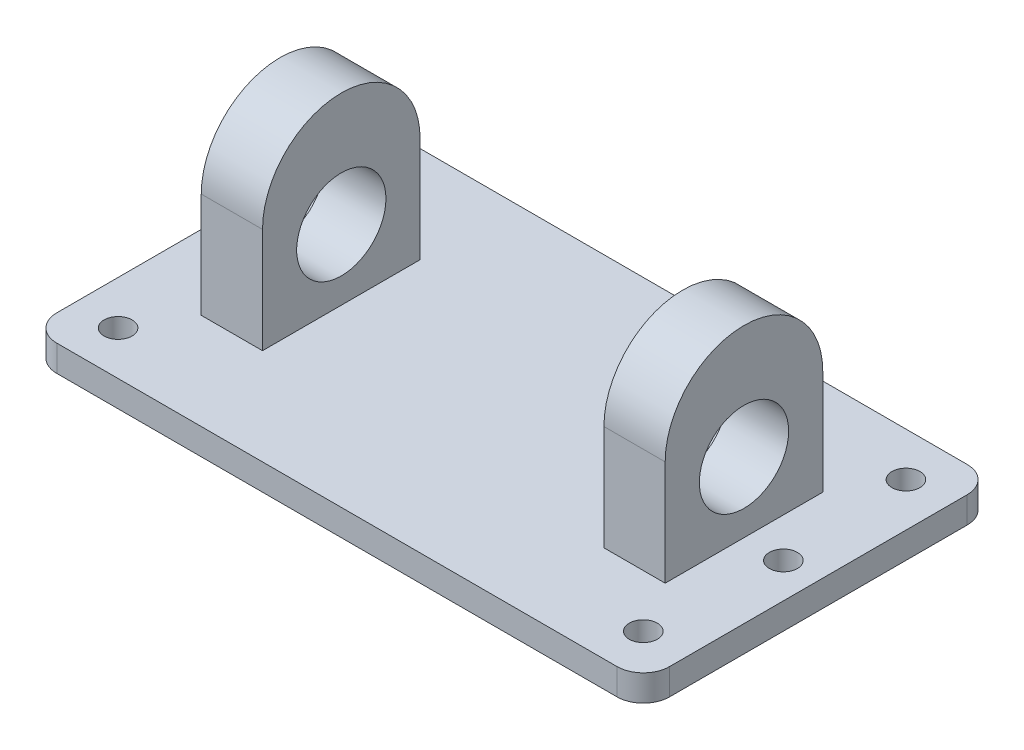
ISO-10303-21;
HEADER;
FILE_DESCRIPTION(('STEP AP214'),'2;1');
FILE_NAME('part.step','',(''),(''),'','','');
FILE_SCHEMA(('AUTOMOTIVE_DESIGN { 1 0 10303 214 1 1 1 1 }'));
ENDSEC;
DATA;
#1=APPLICATION_CONTEXT('core data for automotive mechanical design processes');
#2=APPLICATION_PROTOCOL_DEFINITION('international standard','automotive_design',2000,#1);
#3=PRODUCT_CONTEXT('',#1,'mechanical');
#4=PRODUCT('Part','Part','',(#3));
#5=PRODUCT_RELATED_PRODUCT_CATEGORY('part','',(#4));
#6=PRODUCT_DEFINITION_FORMATION('','',#4);
#7=PRODUCT_DEFINITION_CONTEXT('part definition',#1,'design');
#8=PRODUCT_DEFINITION('design','',#6,#7);
#9=PRODUCT_DEFINITION_SHAPE('','',#8);
#10=(LENGTH_UNIT() NAMED_UNIT(*) SI_UNIT(.MILLI.,.METRE.));
#11=(NAMED_UNIT(*) PLANE_ANGLE_UNIT() SI_UNIT($,.RADIAN.));
#12=(NAMED_UNIT(*) SI_UNIT($,.STERADIAN.) SOLID_ANGLE_UNIT());
#13=UNCERTAINTY_MEASURE_WITH_UNIT(LENGTH_MEASURE(1.E-05),#10,'distance_accuracy_value','');
#14=(GEOMETRIC_REPRESENTATION_CONTEXT(3) GLOBAL_UNCERTAINTY_ASSIGNED_CONTEXT((#13)) GLOBAL_UNIT_ASSIGNED_CONTEXT((#10,
#11,#12)) REPRESENTATION_CONTEXT('',''));
#15=CARTESIAN_POINT('',(0.,0.,0.));
#16=DIRECTION('',(0.,0.,1.));
#17=DIRECTION('',(1.,0.,0.));
#18=AXIS2_PLACEMENT_3D('',#15,#16,#17);
#19=CARTESIAN_POINT('',(32.,3.,17.));
#20=DIRECTION('',(0.,1.,0.));
#21=DIRECTION('',(0.,0.,1.));
#22=AXIS2_PLACEMENT_3D('',#19,#20,#21);
#23=PLANE('',#22);
#24=CARTESIAN_POINT('',(-30.,3.,15.));
#25=DIRECTION('',(0.,1.,0.));
#26=DIRECTION('',(0.,0.,1.));
#27=AXIS2_PLACEMENT_3D('',#24,#25,#26);
#28=CIRCLE('',#27,1.6);
#29=CARTESIAN_POINT('',(-30.,3.,16.6));
#30=VERTEX_POINT('',#29);
#31=EDGE_CURVE('E630',#30,#30,#28,.T.);
#32=ORIENTED_EDGE('',*,*,#31,.F.);
#33=EDGE_LOOP('',(#32));
#34=FACE_BOUND('',#33,.T.);
#35=CARTESIAN_POINT('',(30.,3.,15.));
#36=DIRECTION('',(0.,1.,0.));
#37=DIRECTION('',(0.,0.,1.));
#38=AXIS2_PLACEMENT_3D('',#35,#36,#37);
#39=CIRCLE('',#38,1.6);
#40=CARTESIAN_POINT('',(30.,3.,16.6));
#41=VERTEX_POINT('',#40);
#42=EDGE_CURVE('E633',#41,#41,#39,.T.);
#43=ORIENTED_EDGE('',*,*,#42,.F.);
#44=EDGE_LOOP('',(#43));
#45=FACE_BOUND('',#44,.T.);
#46=CARTESIAN_POINT('',(30.,3.,-15.));
#47=DIRECTION('',(0.,1.,0.));
#48=DIRECTION('',(0.,0.,1.));
#49=AXIS2_PLACEMENT_3D('',#46,#47,#48);
#50=CIRCLE('',#49,1.6);
#51=CARTESIAN_POINT('',(30.,3.,-13.4));
#52=VERTEX_POINT('',#51);
#53=EDGE_CURVE('E629',#52,#52,#50,.T.);
#54=ORIENTED_EDGE('',*,*,#53,.F.);
#55=EDGE_LOOP('',(#54));
#56=FACE_BOUND('',#55,.T.);
#57=CARTESIAN_POINT('',(-30.,3.,-15.));
#58=DIRECTION('',(0.,1.,0.));
#59=DIRECTION('',(0.,0.,1.));
#60=AXIS2_PLACEMENT_3D('',#57,#58,#59);
#61=CIRCLE('',#60,1.6);
#62=CARTESIAN_POINT('',(-30.,3.,-13.4));
#63=VERTEX_POINT('',#62);
#64=EDGE_CURVE('E271',#63,#63,#61,.T.);
#65=ORIENTED_EDGE('',*,*,#64,.F.);
#66=EDGE_LOOP('',(#65));
#67=FACE_BOUND('',#66,.T.);
#68=CARTESIAN_POINT('',(-31.,3.,0.));
#69=DIRECTION('',(0.,1.,0.));
#70=DIRECTION('',(0.,0.,1.));
#71=AXIS2_PLACEMENT_3D('',#68,#69,#70);
#72=CIRCLE('',#71,1.6);
#73=CARTESIAN_POINT('',(-31.,3.,1.6));
#74=VERTEX_POINT('',#73);
#75=EDGE_CURVE('E287',#74,#74,#72,.T.);
#76=ORIENTED_EDGE('',*,*,#75,.F.);
#77=EDGE_LOOP('',(#76));
#78=FACE_BOUND('',#77,.T.);
#79=CARTESIAN_POINT('',(31.,3.,0.));
#80=DIRECTION('',(0.,1.,0.));
#81=DIRECTION('',(0.,0.,1.));
#82=AXIS2_PLACEMENT_3D('',#79,#80,#81);
#83=CIRCLE('',#82,1.6);
#84=CARTESIAN_POINT('',(31.,3.,1.6));
#85=VERTEX_POINT('',#84);
#86=EDGE_CURVE('E278',#85,#85,#83,.T.);
#87=ORIENTED_EDGE('',*,*,#86,.F.);
#88=EDGE_LOOP('',(#87));
#89=FACE_BOUND('',#88,.T.);
#90=DIRECTION('',(0.,0.,-1.));
#91=VECTOR('',#90,1.);
#92=CARTESIAN_POINT('',(-26.5,3.,9.00000000000001));
#93=LINE('',#92,#91);
#94=CARTESIAN_POINT('',(-26.5,3.,9.00000000000001));
#95=VERTEX_POINT('',#94);
#96=CARTESIAN_POINT('',(-26.5,3.,-8.99999999999999));
#97=VERTEX_POINT('',#96);
#98=EDGE_CURVE('E164',#95,#97,#93,.T.);
#99=ORIENTED_EDGE('',*,*,#98,.T.);
#100=DIRECTION('',(1.,0.,0.));
#101=VECTOR('',#100,1.);
#102=CARTESIAN_POINT('',(-19.5,3.,-8.99999999999999));
#103=LINE('',#102,#101);
#104=CARTESIAN_POINT('',(-19.5,3.,-8.99999999999999));
#105=VERTEX_POINT('',#104);
#106=EDGE_CURVE('E171',#97,#105,#103,.T.);
#107=ORIENTED_EDGE('',*,*,#106,.T.);
#108=DIRECTION('',(0.,0.,1.));
#109=VECTOR('',#108,1.);
#110=CARTESIAN_POINT('',(-19.5,3.,9.00000000000001));
#111=LINE('',#110,#109);
#112=CARTESIAN_POINT('',(-19.5,3.,9.00000000000001));
#113=VERTEX_POINT('',#112);
#114=EDGE_CURVE('E56',#105,#113,#111,.T.);
#115=ORIENTED_EDGE('',*,*,#114,.T.);
#116=DIRECTION('',(-1.,0.,0.));
#117=VECTOR('',#116,1.);
#118=CARTESIAN_POINT('',(-19.5,3.,9.00000000000001));
#119=LINE('',#118,#117);
#120=EDGE_CURVE('E51',#113,#95,#119,.T.);
#121=ORIENTED_EDGE('',*,*,#120,.T.);
#122=EDGE_LOOP('',(#99,#107,#115,#121));
#123=FACE_BOUND('',#122,.T.);
#124=CARTESIAN_POINT('',(32.,3.,17.));
#125=DIRECTION('',(0.,1.,0.));
#126=DIRECTION('',(0.,0.,1.));
#127=AXIS2_PLACEMENT_3D('',#124,#125,#126);
#128=CIRCLE('',#127,3.);
#129=CARTESIAN_POINT('',(32.,3.,20.));
#130=VERTEX_POINT('',#129);
#131=CARTESIAN_POINT('',(35.,3.,17.));
#132=VERTEX_POINT('',#131);
#133=EDGE_CURVE('E214',#130,#132,#128,.T.);
#134=ORIENTED_EDGE('',*,*,#133,.T.);
#135=DIRECTION('',(0.,0.,-1.));
#136=VECTOR('',#135,1.);
#137=CARTESIAN_POINT('',(35.,3.,17.));
#138=LINE('',#137,#136);
#139=CARTESIAN_POINT('',(35.,3.,-17.));
#140=VERTEX_POINT('',#139);
#141=EDGE_CURVE('E217',#132,#140,#138,.T.);
#142=ORIENTED_EDGE('',*,*,#141,.T.);
#143=CARTESIAN_POINT('',(32.,3.,-17.));
#144=DIRECTION('',(0.,1.,0.));
#145=DIRECTION('',(0.,0.,-1.));
#146=AXIS2_PLACEMENT_3D('',#143,#144,#145);
#147=CIRCLE('',#146,3.);
#148=CARTESIAN_POINT('',(32.,3.,-20.));
#149=VERTEX_POINT('',#148);
#150=EDGE_CURVE('E220',#140,#149,#147,.T.);
#151=ORIENTED_EDGE('',*,*,#150,.T.);
#152=DIRECTION('',(-1.,0.,0.));
#153=VECTOR('',#152,1.);
#154=CARTESIAN_POINT('',(-32.,3.,-20.));
#155=LINE('',#154,#153);
#156=CARTESIAN_POINT('',(-32.,3.,-20.));
#157=VERTEX_POINT('',#156);
#158=EDGE_CURVE('E222',#149,#157,#155,.T.);
#159=ORIENTED_EDGE('',*,*,#158,.T.);
#160=CARTESIAN_POINT('',(-32.,3.,-17.));
#161=DIRECTION('',(0.,1.,0.));
#162=DIRECTION('',(0.,0.,-1.));
#163=AXIS2_PLACEMENT_3D('',#160,#161,#162);
#164=CIRCLE('',#163,3.);
#165=CARTESIAN_POINT('',(-35.,3.,-17.));
#166=VERTEX_POINT('',#165);
#167=EDGE_CURVE('E224',#157,#166,#164,.T.);
#168=ORIENTED_EDGE('',*,*,#167,.T.);
#169=DIRECTION('',(0.,0.,1.));
#170=VECTOR('',#169,1.);
#171=CARTESIAN_POINT('',(-35.,3.,17.));
#172=LINE('',#171,#170);
#173=CARTESIAN_POINT('',(-35.,3.,17.));
#174=VERTEX_POINT('',#173);
#175=EDGE_CURVE('E226',#166,#174,#172,.T.);
#176=ORIENTED_EDGE('',*,*,#175,.T.);
#177=CARTESIAN_POINT('',(-32.,3.,17.));
#178=DIRECTION('',(0.,1.,0.));
#179=DIRECTION('',(0.,0.,-1.));
#180=AXIS2_PLACEMENT_3D('',#177,#178,#179);
#181=CIRCLE('',#180,3.);
#182=CARTESIAN_POINT('',(-32.,3.,20.));
#183=VERTEX_POINT('',#182);
#184=EDGE_CURVE('E228',#174,#183,#181,.T.);
#185=ORIENTED_EDGE('',*,*,#184,.T.);
#186=DIRECTION('',(1.,0.,0.));
#187=VECTOR('',#186,1.);
#188=CARTESIAN_POINT('',(-32.,3.,20.));
#189=LINE('',#188,#187);
#190=EDGE_CURVE('E230',#183,#130,#189,.T.);
#191=ORIENTED_EDGE('',*,*,#190,.T.);
#192=EDGE_LOOP('',(#134,#142,#151,#159,#168,#176,#185,#191));
#193=FACE_BOUND('',#192,.T.);
#194=DIRECTION('',(-1.,0.,0.));
#195=VECTOR('',#194,1.);
#196=CARTESIAN_POINT('',(19.5,3.,-8.99999999999999));
#197=LINE('',#196,#195);
#198=CARTESIAN_POINT('',(26.5,3.,-8.99999999999999));
#199=VERTEX_POINT('',#198);
#200=CARTESIAN_POINT('',(19.5,3.,-8.99999999999999));
#201=VERTEX_POINT('',#200);
#202=EDGE_CURVE('E198',#199,#201,#197,.T.);
#203=ORIENTED_EDGE('',*,*,#202,.F.);
#204=DIRECTION('',(0.,0.,-1.));
#205=VECTOR('',#204,1.);
#206=CARTESIAN_POINT('',(26.5,3.,9.00000000000001));
#207=LINE('',#206,#205);
#208=CARTESIAN_POINT('',(26.5,3.,9.00000000000001));
#209=VERTEX_POINT('',#208);
#210=EDGE_CURVE('E166',#209,#199,#207,.T.);
#211=ORIENTED_EDGE('',*,*,#210,.F.);
#212=DIRECTION('',(1.,0.,0.));
#213=VECTOR('',#212,1.);
#214=CARTESIAN_POINT('',(19.5,3.,9.00000000000001));
#215=LINE('',#214,#213);
#216=CARTESIAN_POINT('',(19.5,3.,9.00000000000001));
#217=VERTEX_POINT('',#216);
#218=EDGE_CURVE('E192',#217,#209,#215,.T.);
#219=ORIENTED_EDGE('',*,*,#218,.F.);
#220=DIRECTION('',(0.,0.,1.));
#221=VECTOR('',#220,1.);
#222=CARTESIAN_POINT('',(19.5,3.,9.00000000000001));
#223=LINE('',#222,#221);
#224=EDGE_CURVE('E200',#201,#217,#223,.T.);
#225=ORIENTED_EDGE('',*,*,#224,.F.);
#226=EDGE_LOOP('',(#203,#211,#219,#225));
#227=FACE_BOUND('',#226,.T.);
#228=ADVANCED_FACE('F34',(#34,#45,#56,#67,#78,#89,#123,#193,#227),#23,.T.);
#229=CARTESIAN_POINT('',(32.,3.,17.));
#230=DIRECTION('',(0.,-1.,0.));
#231=DIRECTION('',(0.,0.,-1.));
#232=AXIS2_PLACEMENT_3D('',#229,#230,#231);
#233=CYLINDRICAL_SURFACE('',#232,3.);
#234=CARTESIAN_POINT('',(32.,0.,17.));
#235=DIRECTION('',(0.,1.,0.));
#236=DIRECTION('',(0.,0.,1.));
#237=AXIS2_PLACEMENT_3D('',#234,#235,#236);
#238=CIRCLE('',#237,3.);
#239=CARTESIAN_POINT('',(32.,0.,20.));
#240=VERTEX_POINT('',#239);
#241=CARTESIAN_POINT('',(35.,0.,17.));
#242=VERTEX_POINT('',#241);
#243=EDGE_CURVE('E213',#240,#242,#238,.T.);
#244=ORIENTED_EDGE('',*,*,#243,.T.);
#245=DIRECTION('',(0.,-1.,0.));
#246=VECTOR('',#245,1.);
#247=CARTESIAN_POINT('',(35.,3.,17.));
#248=LINE('',#247,#246);
#249=EDGE_CURVE('E11',#132,#242,#248,.T.);
#250=ORIENTED_EDGE('',*,*,#249,.F.);
#251=ORIENTED_EDGE('',*,*,#133,.F.);
#252=DIRECTION('',(0.,-1.,0.));
#253=VECTOR('',#252,1.);
#254=CARTESIAN_POINT('',(32.,3.,20.));
#255=LINE('',#254,#253);
#256=EDGE_CURVE('E232',#130,#240,#255,.T.);
#257=ORIENTED_EDGE('',*,*,#256,.T.);
#258=EDGE_LOOP('',(#244,#250,#251,#257));
#259=FACE_BOUND('',#258,.T.);
#260=ADVANCED_FACE('F36',(#259),#233,.T.);
#261=CARTESIAN_POINT('',(35.,3.,17.));
#262=DIRECTION('',(-1.,0.,0.));
#263=DIRECTION('',(0.,0.,1.));
#264=AXIS2_PLACEMENT_3D('',#261,#262,#263);
#265=PLANE('',#264);
#266=DIRECTION('',(0.,0.,-1.));
#267=VECTOR('',#266,1.);
#268=CARTESIAN_POINT('',(35.,0.,17.));
#269=LINE('',#268,#267);
#270=CARTESIAN_POINT('',(35.,0.,-17.));
#271=VERTEX_POINT('',#270);
#272=EDGE_CURVE('E235',#242,#271,#269,.T.);
#273=ORIENTED_EDGE('',*,*,#272,.T.);
#274=DIRECTION('',(0.,-1.,0.));
#275=VECTOR('',#274,1.);
#276=CARTESIAN_POINT('',(35.,3.,-17.));
#277=LINE('',#276,#275);
#278=EDGE_CURVE('E43',#140,#271,#277,.T.);
#279=ORIENTED_EDGE('',*,*,#278,.F.);
#280=ORIENTED_EDGE('',*,*,#141,.F.);
#281=ORIENTED_EDGE('',*,*,#249,.T.);
#282=EDGE_LOOP('',(#273,#279,#280,#281));
#283=FACE_BOUND('',#282,.T.);
#284=ADVANCED_FACE('F329',(#283),#265,.F.);
#285=CARTESIAN_POINT('',(32.,3.,-17.));
#286=DIRECTION('',(0.,-1.,0.));
#287=DIRECTION('',(0.,0.,-1.));
#288=AXIS2_PLACEMENT_3D('',#285,#286,#287);
#289=CYLINDRICAL_SURFACE('',#288,3.);
#290=CARTESIAN_POINT('',(32.,0.,-17.));
#291=DIRECTION('',(0.,1.,0.));
#292=DIRECTION('',(0.,0.,-1.));
#293=AXIS2_PLACEMENT_3D('',#290,#291,#292);
#294=CIRCLE('',#293,3.);
#295=CARTESIAN_POINT('',(32.,0.,-20.));
#296=VERTEX_POINT('',#295);
#297=EDGE_CURVE('E237',#271,#296,#294,.T.);
#298=ORIENTED_EDGE('',*,*,#297,.T.);
#299=DIRECTION('',(0.,-1.,0.));
#300=VECTOR('',#299,1.);
#301=CARTESIAN_POINT('',(32.,3.,-20.));
#302=LINE('',#301,#300);
#303=EDGE_CURVE('E262',#149,#296,#302,.T.);
#304=ORIENTED_EDGE('',*,*,#303,.F.);
#305=ORIENTED_EDGE('',*,*,#150,.F.);
#306=ORIENTED_EDGE('',*,*,#278,.T.);
#307=EDGE_LOOP('',(#298,#304,#305,#306));
#308=FACE_BOUND('',#307,.T.);
#309=ADVANCED_FACE('F358',(#308),#289,.T.);
#310=CARTESIAN_POINT('',(-32.,3.,-20.));
#311=DIRECTION('',(0.,0.,1.));
#312=DIRECTION('',(1.,0.,0.));
#313=AXIS2_PLACEMENT_3D('',#310,#311,#312);
#314=PLANE('',#313);
#315=DIRECTION('',(-1.,0.,0.));
#316=VECTOR('',#315,1.);
#317=CARTESIAN_POINT('',(-32.,0.,-20.));
#318=LINE('',#317,#316);
#319=CARTESIAN_POINT('',(-32.,0.,-20.));
#320=VERTEX_POINT('',#319);
#321=EDGE_CURVE('E239',#296,#320,#318,.T.);
#322=ORIENTED_EDGE('',*,*,#321,.T.);
#323=DIRECTION('',(0.,-1.,0.));
#324=VECTOR('',#323,1.);
#325=CARTESIAN_POINT('',(-32.,3.,-20.));
#326=LINE('',#325,#324);
#327=EDGE_CURVE('E259',#157,#320,#326,.T.);
#328=ORIENTED_EDGE('',*,*,#327,.F.);
#329=ORIENTED_EDGE('',*,*,#158,.F.);
#330=ORIENTED_EDGE('',*,*,#303,.T.);
#331=EDGE_LOOP('',(#322,#328,#329,#330));
#332=FACE_BOUND('',#331,.T.);
#333=ADVANCED_FACE('F354',(#332),#314,.F.);
#334=CARTESIAN_POINT('',(-32.,3.,-17.));
#335=DIRECTION('',(0.,-1.,0.));
#336=DIRECTION('',(0.,0.,-1.));
#337=AXIS2_PLACEMENT_3D('',#334,#335,#336);
#338=CYLINDRICAL_SURFACE('',#337,3.);
#339=CARTESIAN_POINT('',(-32.,0.,-17.));
#340=DIRECTION('',(0.,1.,0.));
#341=DIRECTION('',(0.,0.,-1.));
#342=AXIS2_PLACEMENT_3D('',#339,#340,#341);
#343=CIRCLE('',#342,3.);
#344=CARTESIAN_POINT('',(-35.,0.,-17.));
#345=VERTEX_POINT('',#344);
#346=EDGE_CURVE('E241',#320,#345,#343,.T.);
#347=ORIENTED_EDGE('',*,*,#346,.T.);
#348=DIRECTION('',(0.,-1.,0.));
#349=VECTOR('',#348,1.);
#350=CARTESIAN_POINT('',(-35.,3.,-17.));
#351=LINE('',#350,#349);
#352=EDGE_CURVE('E256',#166,#345,#351,.T.);
#353=ORIENTED_EDGE('',*,*,#352,.F.);
#354=ORIENTED_EDGE('',*,*,#167,.F.);
#355=ORIENTED_EDGE('',*,*,#327,.T.);
#356=EDGE_LOOP('',(#347,#353,#354,#355));
#357=FACE_BOUND('',#356,.T.);
#358=ADVANCED_FACE('F350',(#357),#338,.T.);
#359=CARTESIAN_POINT('',(-35.,3.,17.));
#360=DIRECTION('',(1.,0.,0.));
#361=DIRECTION('',(0.,0.,-1.));
#362=AXIS2_PLACEMENT_3D('',#359,#360,#361);
#363=PLANE('',#362);
#364=DIRECTION('',(0.,0.,1.));
#365=VECTOR('',#364,1.);
#366=CARTESIAN_POINT('',(-35.,0.,17.));
#367=LINE('',#366,#365);
#368=CARTESIAN_POINT('',(-35.,0.,17.));
#369=VERTEX_POINT('',#368);
#370=EDGE_CURVE('E243',#345,#369,#367,.T.);
#371=ORIENTED_EDGE('',*,*,#370,.T.);
#372=DIRECTION('',(0.,-1.,0.));
#373=VECTOR('',#372,1.);
#374=CARTESIAN_POINT('',(-35.,3.,17.));
#375=LINE('',#374,#373);
#376=EDGE_CURVE('E253',#174,#369,#375,.T.);
#377=ORIENTED_EDGE('',*,*,#376,.F.);
#378=ORIENTED_EDGE('',*,*,#175,.F.);
#379=ORIENTED_EDGE('',*,*,#352,.T.);
#380=EDGE_LOOP('',(#371,#377,#378,#379));
#381=FACE_BOUND('',#380,.T.);
#382=ADVANCED_FACE('F346',(#381),#363,.F.);
#383=CARTESIAN_POINT('',(-32.,3.,17.));
#384=DIRECTION('',(0.,-1.,0.));
#385=DIRECTION('',(0.,0.,-1.));
#386=AXIS2_PLACEMENT_3D('',#383,#384,#385);
#387=CYLINDRICAL_SURFACE('',#386,3.);
#388=CARTESIAN_POINT('',(-32.,0.,17.));
#389=DIRECTION('',(0.,1.,0.));
#390=DIRECTION('',(0.,0.,-1.));
#391=AXIS2_PLACEMENT_3D('',#388,#389,#390);
#392=CIRCLE('',#391,3.);
#393=CARTESIAN_POINT('',(-32.,0.,20.));
#394=VERTEX_POINT('',#393);
#395=EDGE_CURVE('E245',#369,#394,#392,.T.);
#396=ORIENTED_EDGE('',*,*,#395,.T.);
#397=DIRECTION('',(0.,-1.,0.));
#398=VECTOR('',#397,1.);
#399=CARTESIAN_POINT('',(-32.,3.,20.));
#400=LINE('',#399,#398);
#401=EDGE_CURVE('E250',#183,#394,#400,.T.);
#402=ORIENTED_EDGE('',*,*,#401,.F.);
#403=ORIENTED_EDGE('',*,*,#184,.F.);
#404=ORIENTED_EDGE('',*,*,#376,.T.);
#405=EDGE_LOOP('',(#396,#402,#403,#404));
#406=FACE_BOUND('',#405,.T.);
#407=ADVANCED_FACE('F342',(#406),#387,.T.);
#408=CARTESIAN_POINT('',(-32.,3.,20.));
#409=DIRECTION('',(0.,0.,-1.));
#410=DIRECTION('',(-1.,0.,0.));
#411=AXIS2_PLACEMENT_3D('',#408,#409,#410);
#412=PLANE('',#411);
#413=DIRECTION('',(1.,0.,0.));
#414=VECTOR('',#413,1.);
#415=CARTESIAN_POINT('',(-32.,0.,20.));
#416=LINE('',#415,#414);
#417=EDGE_CURVE('E218',#394,#240,#416,.T.);
#418=ORIENTED_EDGE('',*,*,#417,.T.);
#419=ORIENTED_EDGE('',*,*,#256,.F.);
#420=ORIENTED_EDGE('',*,*,#190,.F.);
#421=ORIENTED_EDGE('',*,*,#401,.T.);
#422=EDGE_LOOP('',(#418,#419,#420,#421));
#423=FACE_BOUND('',#422,.T.);
#424=ADVANCED_FACE('F339',(#423),#412,.F.);
#425=CARTESIAN_POINT('',(32.,0.,17.));
#426=DIRECTION('',(0.,1.,0.));
#427=DIRECTION('',(0.,0.,1.));
#428=AXIS2_PLACEMENT_3D('',#425,#426,#427);
#429=PLANE('',#428);
#430=CARTESIAN_POINT('',(-30.,0.,15.));
#431=DIRECTION('',(0.,1.,0.));
#432=DIRECTION('',(0.,0.,1.));
#433=AXIS2_PLACEMENT_3D('',#430,#431,#432);
#434=CIRCLE('',#433,1.6);
#435=CARTESIAN_POINT('',(-30.,0.,16.6));
#436=VERTEX_POINT('',#435);
#437=EDGE_CURVE('E276',#436,#436,#434,.T.);
#438=ORIENTED_EDGE('',*,*,#437,.T.);
#439=EDGE_LOOP('',(#438));
#440=FACE_BOUND('',#439,.T.);
#441=CARTESIAN_POINT('',(30.,0.,15.));
#442=DIRECTION('',(0.,1.,0.));
#443=DIRECTION('',(0.,0.,1.));
#444=AXIS2_PLACEMENT_3D('',#441,#442,#443);
#445=CIRCLE('',#444,1.6);
#446=CARTESIAN_POINT('',(30.,0.,16.6));
#447=VERTEX_POINT('',#446);
#448=EDGE_CURVE('E274',#447,#447,#445,.T.);
#449=ORIENTED_EDGE('',*,*,#448,.T.);
#450=EDGE_LOOP('',(#449));
#451=FACE_BOUND('',#450,.T.);
#452=CARTESIAN_POINT('',(30.,0.,-15.));
#453=DIRECTION('',(0.,1.,0.));
#454=DIRECTION('',(0.,0.,1.));
#455=AXIS2_PLACEMENT_3D('',#452,#453,#454);
#456=CIRCLE('',#455,1.6);
#457=CARTESIAN_POINT('',(30.,0.,-13.4));
#458=VERTEX_POINT('',#457);
#459=EDGE_CURVE('E270',#458,#458,#456,.T.);
#460=ORIENTED_EDGE('',*,*,#459,.T.);
#461=EDGE_LOOP('',(#460));
#462=FACE_BOUND('',#461,.T.);
#463=CARTESIAN_POINT('',(-30.,0.,-15.));
#464=DIRECTION('',(0.,1.,0.));
#465=DIRECTION('',(0.,0.,1.));
#466=AXIS2_PLACEMENT_3D('',#463,#464,#465);
#467=CIRCLE('',#466,1.6);
#468=CARTESIAN_POINT('',(-30.,0.,-13.4));
#469=VERTEX_POINT('',#468);
#470=EDGE_CURVE('E267',#469,#469,#467,.T.);
#471=ORIENTED_EDGE('',*,*,#470,.T.);
#472=EDGE_LOOP('',(#471));
#473=FACE_BOUND('',#472,.T.);
#474=CARTESIAN_POINT('',(-31.,0.,0.));
#475=DIRECTION('',(0.,1.,0.));
#476=DIRECTION('',(0.,0.,1.));
#477=AXIS2_PLACEMENT_3D('',#474,#475,#476);
#478=CIRCLE('',#477,1.6);
#479=CARTESIAN_POINT('',(-31.,0.,1.6));
#480=VERTEX_POINT('',#479);
#481=EDGE_CURVE('E159',#480,#480,#478,.T.);
#482=ORIENTED_EDGE('',*,*,#481,.T.);
#483=EDGE_LOOP('',(#482));
#484=FACE_BOUND('',#483,.T.);
#485=CARTESIAN_POINT('',(31.,0.,0.));
#486=DIRECTION('',(0.,1.,0.));
#487=DIRECTION('',(0.,0.,1.));
#488=AXIS2_PLACEMENT_3D('',#485,#486,#487);
#489=CIRCLE('',#488,1.6);
#490=CARTESIAN_POINT('',(31.,0.,1.6));
#491=VERTEX_POINT('',#490);
#492=EDGE_CURVE('E282',#491,#491,#489,.T.);
#493=ORIENTED_EDGE('',*,*,#492,.T.);
#494=EDGE_LOOP('',(#493));
#495=FACE_BOUND('',#494,.T.);
#496=ORIENTED_EDGE('',*,*,#243,.F.);
#497=ORIENTED_EDGE('',*,*,#417,.F.);
#498=ORIENTED_EDGE('',*,*,#395,.F.);
#499=ORIENTED_EDGE('',*,*,#370,.F.);
#500=ORIENTED_EDGE('',*,*,#346,.F.);
#501=ORIENTED_EDGE('',*,*,#321,.F.);
#502=ORIENTED_EDGE('',*,*,#297,.F.);
#503=ORIENTED_EDGE('',*,*,#272,.F.);
#504=EDGE_LOOP('',(#496,#497,#498,#499,#500,#501,#502,#503));
#505=FACE_BOUND('',#504,.T.);
#506=ADVANCED_FACE('F336',(#440,#451,#462,#473,#484,#495,#505),#429,.F.);
#507=CARTESIAN_POINT('',(26.5,15.,9.00000000000001));
#508=DIRECTION('',(-1.,0.,0.));
#509=DIRECTION('',(0.,0.,1.));
#510=AXIS2_PLACEMENT_3D('',#507,#508,#509);
#511=PLANE('',#510);
#512=CARTESIAN_POINT('',(26.5,11.,0.));
#513=DIRECTION('',(1.,0.,0.));
#514=DIRECTION('',(0.,0.,-1.));
#515=AXIS2_PLACEMENT_3D('',#512,#513,#514);
#516=CIRCLE('',#515,5.1);
#517=CARTESIAN_POINT('',(26.5,11.,-5.1));
#518=VERTEX_POINT('',#517);
#519=EDGE_CURVE('E644',#518,#518,#516,.T.);
#520=ORIENTED_EDGE('',*,*,#519,.F.);
#521=EDGE_LOOP('',(#520));
#522=FACE_BOUND('',#521,.T.);
#523=DIRECTION('',(0.,-1.,0.));
#524=VECTOR('',#523,1.);
#525=CARTESIAN_POINT('',(26.5,15.,-8.99999999999999));
#526=LINE('',#525,#524);
#527=CARTESIAN_POINT('',(26.5,15.,-8.99999999999999));
#528=VERTEX_POINT('',#527);
#529=EDGE_CURVE('E211',#528,#199,#526,.T.);
#530=ORIENTED_EDGE('',*,*,#529,.F.);
#531=CARTESIAN_POINT('',(26.5,15.,0.));
#532=DIRECTION('',(1.,0.,0.));
#533=DIRECTION('',(0.,0.,-1.));
#534=AXIS2_PLACEMENT_3D('',#531,#532,#533);
#535=CIRCLE('',#534,9.);
#536=CARTESIAN_POINT('',(26.5,15.,9.00000000000001));
#537=VERTEX_POINT('',#536);
#538=EDGE_CURVE('E291',#528,#537,#535,.T.);
#539=ORIENTED_EDGE('',*,*,#538,.T.);
#540=DIRECTION('',(0.,-1.,0.));
#541=VECTOR('',#540,1.);
#542=CARTESIAN_POINT('',(26.5,15.,9.00000000000001));
#543=LINE('',#542,#541);
#544=EDGE_CURVE('E195',#537,#209,#543,.T.);
#545=ORIENTED_EDGE('',*,*,#544,.T.);
#546=ORIENTED_EDGE('',*,*,#210,.T.);
#547=EDGE_LOOP('',(#530,#539,#545,#546));
#548=FACE_BOUND('',#547,.T.);
#549=ADVANCED_FACE('F306',(#522,#548),#511,.F.);
#550=CARTESIAN_POINT('',(19.5,15.,-8.99999999999999));
#551=DIRECTION('',(0.,0.,1.));
#552=DIRECTION('',(1.,0.,0.));
#553=AXIS2_PLACEMENT_3D('',#550,#551,#552);
#554=PLANE('',#553);
#555=ORIENTED_EDGE('',*,*,#202,.T.);
#556=DIRECTION('',(0.,-1.,0.));
#557=VECTOR('',#556,1.);
#558=CARTESIAN_POINT('',(19.5,15.,-8.99999999999999));
#559=LINE('',#558,#557);
#560=CARTESIAN_POINT('',(19.5,15.,-8.99999999999999));
#561=VERTEX_POINT('',#560);
#562=EDGE_CURVE('E208',#561,#201,#559,.T.);
#563=ORIENTED_EDGE('',*,*,#562,.F.);
#564=DIRECTION('',(-1.,0.,0.));
#565=VECTOR('',#564,1.);
#566=CARTESIAN_POINT('',(19.5,15.,-8.99999999999999));
#567=LINE('',#566,#565);
#568=EDGE_CURVE('E188',#528,#561,#567,.T.);
#569=ORIENTED_EDGE('',*,*,#568,.F.);
#570=ORIENTED_EDGE('',*,*,#529,.T.);
#571=EDGE_LOOP('',(#555,#563,#569,#570));
#572=FACE_BOUND('',#571,.T.);
#573=ADVANCED_FACE('F305',(#572),#554,.F.);
#574=CARTESIAN_POINT('',(19.5,15.,9.00000000000001));
#575=DIRECTION('',(1.,0.,0.));
#576=DIRECTION('',(0.,0.,-1.));
#577=AXIS2_PLACEMENT_3D('',#574,#575,#576);
#578=PLANE('',#577);
#579=CARTESIAN_POINT('',(19.5,11.,0.));
#580=DIRECTION('',(1.,0.,0.));
#581=DIRECTION('',(0.,0.,-1.));
#582=AXIS2_PLACEMENT_3D('',#579,#580,#581);
#583=CIRCLE('',#582,5.1);
#584=CARTESIAN_POINT('',(19.5,11.,-5.1));
#585=VERTEX_POINT('',#584);
#586=EDGE_CURVE('E634',#585,#585,#583,.T.);
#587=ORIENTED_EDGE('',*,*,#586,.T.);
#588=EDGE_LOOP('',(#587));
#589=FACE_BOUND('',#588,.T.);
#590=DIRECTION('',(0.,-1.,0.));
#591=VECTOR('',#590,1.);
#592=CARTESIAN_POINT('',(19.5,15.,9.00000000000001));
#593=LINE('',#592,#591);
#594=CARTESIAN_POINT('',(19.5,15.,9.));
#595=VERTEX_POINT('',#594);
#596=EDGE_CURVE('E206',#595,#217,#593,.T.);
#597=ORIENTED_EDGE('',*,*,#596,.F.);
#598=CARTESIAN_POINT('',(19.5,15.,0.));
#599=DIRECTION('',(1.,0.,0.));
#600=DIRECTION('',(0.,0.,-1.));
#601=AXIS2_PLACEMENT_3D('',#598,#599,#600);
#602=CIRCLE('',#601,9.);
#603=EDGE_CURVE('E177',#595,#561,#602,.F.);
#604=ORIENTED_EDGE('',*,*,#603,.T.);
#605=ORIENTED_EDGE('',*,*,#562,.T.);
#606=ORIENTED_EDGE('',*,*,#224,.T.);
#607=EDGE_LOOP('',(#597,#604,#605,#606));
#608=FACE_BOUND('',#607,.T.);
#609=ADVANCED_FACE('F300',(#589,#608),#578,.F.);
#610=CARTESIAN_POINT('',(19.5,15.,9.00000000000001));
#611=DIRECTION('',(0.,0.,-1.));
#612=DIRECTION('',(-1.,0.,0.));
#613=AXIS2_PLACEMENT_3D('',#610,#611,#612);
#614=PLANE('',#613);
#615=ORIENTED_EDGE('',*,*,#218,.T.);
#616=ORIENTED_EDGE('',*,*,#544,.F.);
#617=DIRECTION('',(1.,0.,0.));
#618=VECTOR('',#617,1.);
#619=CARTESIAN_POINT('',(19.5,15.,9.00000000000001));
#620=LINE('',#619,#618);
#621=EDGE_CURVE('E191',#595,#537,#620,.T.);
#622=ORIENTED_EDGE('',*,*,#621,.F.);
#623=ORIENTED_EDGE('',*,*,#596,.T.);
#624=EDGE_LOOP('',(#615,#616,#622,#623));
#625=FACE_BOUND('',#624,.T.);
#626=ADVANCED_FACE('F312',(#625),#614,.F.);
#627=CARTESIAN_POINT('',(-26.5,15.,9.00000000000001));
#628=DIRECTION('',(-1.,0.,0.));
#629=DIRECTION('',(0.,0.,1.));
#630=AXIS2_PLACEMENT_3D('',#627,#628,#629);
#631=PLANE('',#630);
#632=CARTESIAN_POINT('',(-26.5,11.,0.));
#633=DIRECTION('',(-1.,0.,0.));
#634=DIRECTION('',(0.,0.,1.));
#635=AXIS2_PLACEMENT_3D('',#632,#633,#634);
#636=CIRCLE('',#635,5.1);
#637=CARTESIAN_POINT('',(-26.5,11.,5.1));
#638=VERTEX_POINT('',#637);
#639=EDGE_CURVE('E641',#638,#638,#636,.T.);
#640=ORIENTED_EDGE('',*,*,#639,.F.);
#641=EDGE_LOOP('',(#640));
#642=FACE_BOUND('',#641,.T.);
#643=DIRECTION('',(0.,-1.,0.));
#644=VECTOR('',#643,1.);
#645=CARTESIAN_POINT('',(-26.5,15.,9.00000000000001));
#646=LINE('',#645,#644);
#647=CARTESIAN_POINT('',(-26.5,15.,9.));
#648=VERTEX_POINT('',#647);
#649=EDGE_CURVE('E162',#648,#95,#646,.T.);
#650=ORIENTED_EDGE('',*,*,#649,.F.);
#651=CARTESIAN_POINT('',(-26.5,15.,0.));
#652=DIRECTION('',(-1.,0.,0.));
#653=DIRECTION('',(0.,0.,1.));
#654=AXIS2_PLACEMENT_3D('',#651,#652,#653);
#655=CIRCLE('',#654,9.);
#656=CARTESIAN_POINT('',(-26.5,15.,-9.));
#657=VERTEX_POINT('',#656);
#658=EDGE_CURVE('E147',#648,#657,#655,.T.);
#659=ORIENTED_EDGE('',*,*,#658,.T.);
#660=DIRECTION('',(0.,-1.,0.));
#661=VECTOR('',#660,1.);
#662=CARTESIAN_POINT('',(-26.5,15.,-8.99999999999999));
#663=LINE('',#662,#661);
#664=EDGE_CURVE('E173',#657,#97,#663,.T.);
#665=ORIENTED_EDGE('',*,*,#664,.T.);
#666=ORIENTED_EDGE('',*,*,#98,.F.);
#667=EDGE_LOOP('',(#650,#659,#665,#666));
#668=FACE_BOUND('',#667,.T.);
#669=ADVANCED_FACE('F163',(#642,#668),#631,.T.);
#670=CARTESIAN_POINT('',(-19.5,15.,9.00000000000001));
#671=DIRECTION('',(0.,0.,1.));
#672=DIRECTION('',(1.,0.,0.));
#673=AXIS2_PLACEMENT_3D('',#670,#671,#672);
#674=PLANE('',#673);
#675=ORIENTED_EDGE('',*,*,#120,.F.);
#676=DIRECTION('',(0.,-1.,0.));
#677=VECTOR('',#676,1.);
#678=CARTESIAN_POINT('',(-19.5,15.,9.00000000000001));
#679=LINE('',#678,#677);
#680=CARTESIAN_POINT('',(-19.5,15.,9.));
#681=VERTEX_POINT('',#680);
#682=EDGE_CURVE('E167',#681,#113,#679,.T.);
#683=ORIENTED_EDGE('',*,*,#682,.F.);
#684=DIRECTION('',(-1.,0.,0.));
#685=VECTOR('',#684,1.);
#686=CARTESIAN_POINT('',(-19.5,15.,9.00000000000001));
#687=LINE('',#686,#685);
#688=EDGE_CURVE('E151',#681,#648,#687,.T.);
#689=ORIENTED_EDGE('',*,*,#688,.T.);
#690=ORIENTED_EDGE('',*,*,#649,.T.);
#691=EDGE_LOOP('',(#675,#683,#689,#690));
#692=FACE_BOUND('',#691,.T.);
#693=ADVANCED_FACE('F170',(#692),#674,.T.);
#694=CARTESIAN_POINT('',(-19.5,15.,9.00000000000001));
#695=DIRECTION('',(1.,0.,0.));
#696=DIRECTION('',(0.,0.,-1.));
#697=AXIS2_PLACEMENT_3D('',#694,#695,#696);
#698=PLANE('',#697);
#699=CARTESIAN_POINT('',(-19.5,11.,0.));
#700=DIRECTION('',(1.,0.,0.));
#701=DIRECTION('',(0.,0.,-1.));
#702=AXIS2_PLACEMENT_3D('',#699,#700,#701);
#703=CIRCLE('',#702,5.1);
#704=CARTESIAN_POINT('',(-19.5,11.,-5.1));
#705=VERTEX_POINT('',#704);
#706=EDGE_CURVE('E38',#705,#705,#703,.T.);
#707=ORIENTED_EDGE('',*,*,#706,.F.);
#708=EDGE_LOOP('',(#707));
#709=FACE_BOUND('',#708,.T.);
#710=DIRECTION('',(0.,-1.,0.));
#711=VECTOR('',#710,1.);
#712=CARTESIAN_POINT('',(-19.5,15.,-8.99999999999999));
#713=LINE('',#712,#711);
#714=CARTESIAN_POINT('',(-19.5,15.,-8.99999999999999));
#715=VERTEX_POINT('',#714);
#716=EDGE_CURVE('E184',#715,#105,#713,.T.);
#717=ORIENTED_EDGE('',*,*,#716,.F.);
#718=CARTESIAN_POINT('',(-19.5,15.,0.));
#719=DIRECTION('',(1.,0.,0.));
#720=DIRECTION('',(0.,0.,-1.));
#721=AXIS2_PLACEMENT_3D('',#718,#719,#720);
#722=CIRCLE('',#721,9.);
#723=EDGE_CURVE('E158',#681,#715,#722,.F.);
#724=ORIENTED_EDGE('',*,*,#723,.F.);
#725=ORIENTED_EDGE('',*,*,#682,.T.);
#726=ORIENTED_EDGE('',*,*,#114,.F.);
#727=EDGE_LOOP('',(#717,#724,#725,#726));
#728=FACE_BOUND('',#727,.T.);
#729=ADVANCED_FACE('F453',(#709,#728),#698,.T.);
#730=CARTESIAN_POINT('',(-19.5,15.,-8.99999999999999));
#731=DIRECTION('',(0.,0.,-1.));
#732=DIRECTION('',(-1.,0.,0.));
#733=AXIS2_PLACEMENT_3D('',#730,#731,#732);
#734=PLANE('',#733);
#735=ORIENTED_EDGE('',*,*,#106,.F.);
#736=ORIENTED_EDGE('',*,*,#664,.F.);
#737=DIRECTION('',(1.,0.,0.));
#738=VECTOR('',#737,1.);
#739=CARTESIAN_POINT('',(-19.5,15.,-8.99999999999999));
#740=LINE('',#739,#738);
#741=EDGE_CURVE('E154',#657,#715,#740,.T.);
#742=ORIENTED_EDGE('',*,*,#741,.T.);
#743=ORIENTED_EDGE('',*,*,#716,.T.);
#744=EDGE_LOOP('',(#735,#736,#742,#743));
#745=FACE_BOUND('',#744,.T.);
#746=ADVANCED_FACE('F457',(#745),#734,.T.);
#747=CARTESIAN_POINT('',(-5.95584412271572,15.,0.));
#748=DIRECTION('',(1.,0.,0.));
#749=DIRECTION('',(0.,0.,-1.));
#750=AXIS2_PLACEMENT_3D('',#747,#748,#749);
#751=CYLINDRICAL_SURFACE('',#750,9.);
#752=ORIENTED_EDGE('',*,*,#568,.T.);
#753=ORIENTED_EDGE('',*,*,#603,.F.);
#754=ORIENTED_EDGE('',*,*,#621,.T.);
#755=ORIENTED_EDGE('',*,*,#538,.F.);
#756=EDGE_LOOP('',(#752,#753,#754,#755));
#757=FACE_BOUND('',#756,.T.);
#758=ADVANCED_FACE('F303',(#757),#751,.T.);
#759=CARTESIAN_POINT('',(5.95584412271572,15.,0.));
#760=DIRECTION('',(-1.,0.,0.));
#761=DIRECTION('',(0.,0.,1.));
#762=AXIS2_PLACEMENT_3D('',#759,#760,#761);
#763=CYLINDRICAL_SURFACE('',#762,9.);
#764=ORIENTED_EDGE('',*,*,#688,.F.);
#765=ORIENTED_EDGE('',*,*,#723,.T.);
#766=ORIENTED_EDGE('',*,*,#741,.F.);
#767=ORIENTED_EDGE('',*,*,#658,.F.);
#768=EDGE_LOOP('',(#764,#765,#766,#767));
#769=FACE_BOUND('',#768,.T.);
#770=ADVANCED_FACE('F149',(#769),#763,.T.);
#771=CARTESIAN_POINT('',(31.,0.,0.));
#772=DIRECTION('',(0.,1.,0.));
#773=DIRECTION('',(0.,0.,1.));
#774=AXIS2_PLACEMENT_3D('',#771,#772,#773);
#775=CYLINDRICAL_SURFACE('',#774,1.6);
#776=ORIENTED_EDGE('',*,*,#492,.F.);
#777=EDGE_LOOP('',(#776));
#778=FACE_BOUND('',#777,.T.);
#779=ORIENTED_EDGE('',*,*,#86,.T.);
#780=EDGE_LOOP('',(#779));
#781=FACE_BOUND('',#780,.T.);
#782=ADVANCED_FACE('F507',(#778,#781),#775,.F.);
#783=CARTESIAN_POINT('',(-31.,0.,0.));
#784=DIRECTION('',(0.,1.,0.));
#785=DIRECTION('',(0.,0.,1.));
#786=AXIS2_PLACEMENT_3D('',#783,#784,#785);
#787=CYLINDRICAL_SURFACE('',#786,1.6);
#788=ORIENTED_EDGE('',*,*,#481,.F.);
#789=EDGE_LOOP('',(#788));
#790=FACE_BOUND('',#789,.T.);
#791=ORIENTED_EDGE('',*,*,#75,.T.);
#792=EDGE_LOOP('',(#791));
#793=FACE_BOUND('',#792,.T.);
#794=ADVANCED_FACE('F503',(#790,#793),#787,.F.);
#795=CARTESIAN_POINT('',(-30.,-7.,-15.));
#796=DIRECTION('',(0.,1.,0.));
#797=DIRECTION('',(0.,0.,1.));
#798=AXIS2_PLACEMENT_3D('',#795,#796,#797);
#799=CYLINDRICAL_SURFACE('',#798,1.6);
#800=ORIENTED_EDGE('',*,*,#64,.T.);
#801=EDGE_LOOP('',(#800));
#802=FACE_BOUND('',#801,.T.);
#803=ORIENTED_EDGE('',*,*,#470,.F.);
#804=EDGE_LOOP('',(#803));
#805=FACE_BOUND('',#804,.T.);
#806=ADVANCED_FACE('F494',(#802,#805),#799,.F.);
#807=CARTESIAN_POINT('',(30.,-7.,-15.));
#808=DIRECTION('',(0.,1.,0.));
#809=DIRECTION('',(0.,0.,1.));
#810=AXIS2_PLACEMENT_3D('',#807,#808,#809);
#811=CYLINDRICAL_SURFACE('',#810,1.6);
#812=ORIENTED_EDGE('',*,*,#53,.T.);
#813=EDGE_LOOP('',(#812));
#814=FACE_BOUND('',#813,.T.);
#815=ORIENTED_EDGE('',*,*,#459,.F.);
#816=EDGE_LOOP('',(#815));
#817=FACE_BOUND('',#816,.T.);
#818=ADVANCED_FACE('F490',(#814,#817),#811,.F.);
#819=CARTESIAN_POINT('',(30.,-7.,15.));
#820=DIRECTION('',(0.,1.,0.));
#821=DIRECTION('',(0.,0.,1.));
#822=AXIS2_PLACEMENT_3D('',#819,#820,#821);
#823=CYLINDRICAL_SURFACE('',#822,1.6);
#824=ORIENTED_EDGE('',*,*,#42,.T.);
#825=EDGE_LOOP('',(#824));
#826=FACE_BOUND('',#825,.T.);
#827=ORIENTED_EDGE('',*,*,#448,.F.);
#828=EDGE_LOOP('',(#827));
#829=FACE_BOUND('',#828,.T.);
#830=ADVANCED_FACE('F493',(#826,#829),#823,.F.);
#831=CARTESIAN_POINT('',(-30.,-7.,15.));
#832=DIRECTION('',(0.,1.,0.));
#833=DIRECTION('',(0.,0.,1.));
#834=AXIS2_PLACEMENT_3D('',#831,#832,#833);
#835=CYLINDRICAL_SURFACE('',#834,1.6);
#836=ORIENTED_EDGE('',*,*,#31,.T.);
#837=EDGE_LOOP('',(#836));
#838=FACE_BOUND('',#837,.T.);
#839=ORIENTED_EDGE('',*,*,#437,.F.);
#840=EDGE_LOOP('',(#839));
#841=FACE_BOUND('',#840,.T.);
#842=ADVANCED_FACE('F472',(#838,#841),#835,.F.);
#843=CARTESIAN_POINT('',(-35.,11.,0.));
#844=DIRECTION('',(1.,0.,0.));
#845=DIRECTION('',(0.,0.,-1.));
#846=AXIS2_PLACEMENT_3D('',#843,#844,#845);
#847=CYLINDRICAL_SURFACE('',#846,5.1);
#848=ORIENTED_EDGE('',*,*,#639,.T.);
#849=EDGE_LOOP('',(#848));
#850=FACE_BOUND('',#849,.T.);
#851=ORIENTED_EDGE('',*,*,#706,.T.);
#852=EDGE_LOOP('',(#851));
#853=FACE_BOUND('',#852,.T.);
#854=ADVANCED_FACE('F466',(#850,#853),#847,.F.);
#855=ORIENTED_EDGE('',*,*,#519,.T.);
#856=EDGE_LOOP('',(#855));
#857=FACE_BOUND('',#856,.T.);
#858=ORIENTED_EDGE('',*,*,#586,.F.);
#859=EDGE_LOOP('',(#858));
#860=FACE_BOUND('',#859,.T.);
#861=ADVANCED_FACE('F471',(#857,#860),#847,.F.);
#862=CLOSED_SHELL('',(#228,#260,#284,#309,#333,#358,#382,#407,#424,#506,#549,#573,#609,#626,
#669,#693,#729,#746,#758,#770,#782,#794,#806,#818,#830,#842,#854,#861));
#863=MANIFOLD_SOLID_BREP('B2',#862);
#864=ADVANCED_BREP_SHAPE_REPRESENTATION('',(#18,#863),#14);
#865=SHAPE_DEFINITION_REPRESENTATION(#9,#864);
ENDSEC;
END-ISO-10303-21;
